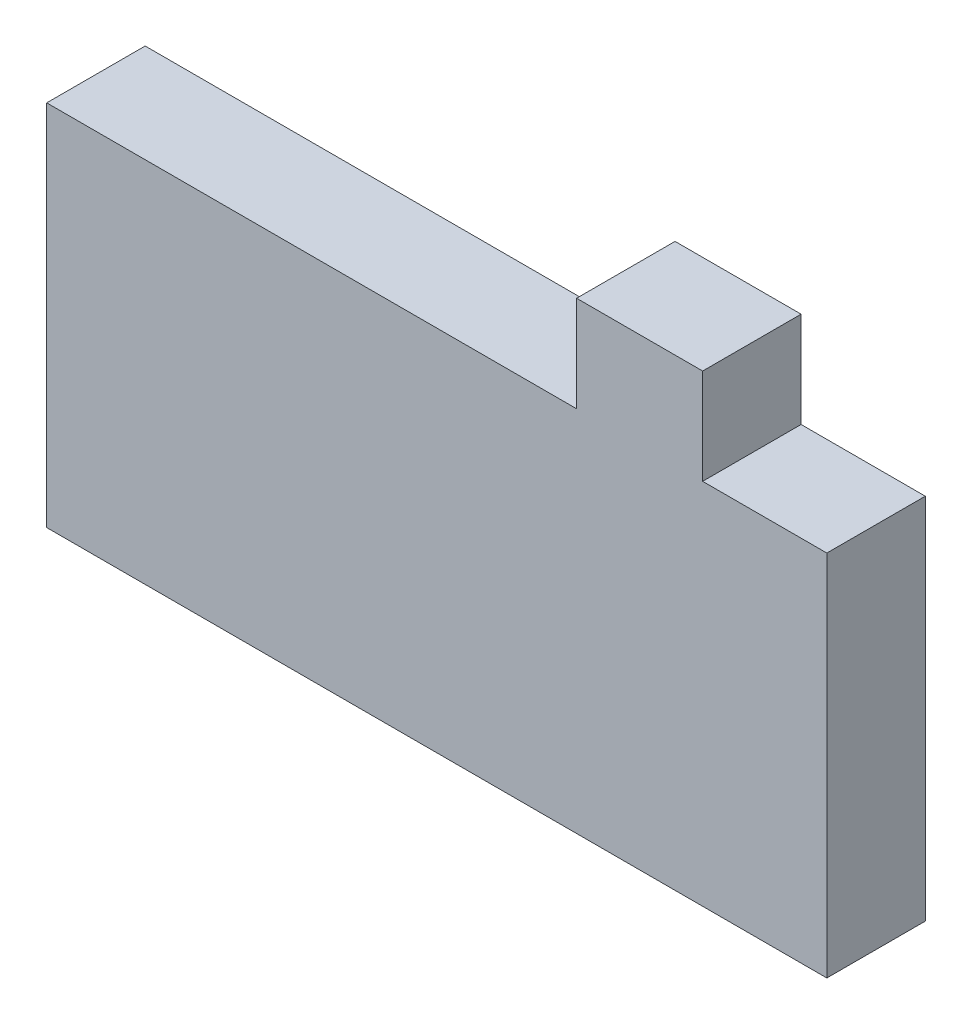
ISO-10303-21;
HEADER;
FILE_DESCRIPTION(('STEP AP214'),'2;1');
FILE_NAME('part.step','',(''),(''),'','','');
FILE_SCHEMA(('AUTOMOTIVE_DESIGN { 1 0 10303 214 1 1 1 1 }'));
ENDSEC;
DATA;
#1=APPLICATION_CONTEXT('core data for automotive mechanical design processes');
#2=APPLICATION_PROTOCOL_DEFINITION('international standard','automotive_design',2000,#1);
#3=PRODUCT_CONTEXT('',#1,'mechanical');
#4=PRODUCT('Part','Part','',(#3));
#5=PRODUCT_RELATED_PRODUCT_CATEGORY('part','',(#4));
#6=PRODUCT_DEFINITION_FORMATION('','',#4);
#7=PRODUCT_DEFINITION_CONTEXT('part definition',#1,'design');
#8=PRODUCT_DEFINITION('design','',#6,#7);
#9=PRODUCT_DEFINITION_SHAPE('','',#8);
#10=(LENGTH_UNIT() NAMED_UNIT(*) SI_UNIT(.MILLI.,.METRE.));
#11=(NAMED_UNIT(*) PLANE_ANGLE_UNIT() SI_UNIT($,.RADIAN.));
#12=(NAMED_UNIT(*) SI_UNIT($,.STERADIAN.) SOLID_ANGLE_UNIT());
#13=UNCERTAINTY_MEASURE_WITH_UNIT(LENGTH_MEASURE(1.E-05),#10,'distance_accuracy_value','');
#14=(GEOMETRIC_REPRESENTATION_CONTEXT(3) GLOBAL_UNCERTAINTY_ASSIGNED_CONTEXT((#13)) GLOBAL_UNIT_ASSIGNED_CONTEXT((#10,
#11,#12)) REPRESENTATION_CONTEXT('',''));
#15=CARTESIAN_POINT('',(0.,0.,0.));
#16=DIRECTION('',(0.,0.,1.));
#17=DIRECTION('',(1.,0.,0.));
#18=AXIS2_PLACEMENT_3D('',#15,#16,#17);
#19=CARTESIAN_POINT('',(-61.3363295036592,27.7399573483474,20.));
#20=DIRECTION('',(1.,0.,0.));
#21=DIRECTION('',(0.,0.,-1.));
#22=AXIS2_PLACEMENT_3D('',#19,#20,#21);
#23=PLANE('',#22);
#24=DIRECTION('',(0.,-1.,0.));
#25=VECTOR('',#24,1.);
#26=CARTESIAN_POINT('',(-61.3363295036592,27.7399573483474,0.));
#27=LINE('',#26,#25);
#28=CARTESIAN_POINT('',(-61.3363295036592,27.7399573483474,0.));
#29=VERTEX_POINT('',#28);
#30=CARTESIAN_POINT('',(-61.3363295036592,-46.9810183432283,0.));
#31=VERTEX_POINT('',#30);
#32=EDGE_CURVE('E145',#29,#31,#27,.T.);
#33=ORIENTED_EDGE('',*,*,#32,.T.);
#34=DIRECTION('',(0.,0.,-1.));
#35=VECTOR('',#34,1.);
#36=CARTESIAN_POINT('',(-61.3363295036592,-46.9810183432283,20.));
#37=LINE('',#36,#35);
#38=CARTESIAN_POINT('',(-61.3363295036592,-46.9810183432283,20.));
#39=VERTEX_POINT('',#38);
#40=EDGE_CURVE('E11',#39,#31,#37,.T.);
#41=ORIENTED_EDGE('',*,*,#40,.F.);
#42=DIRECTION('',(0.,-1.,0.));
#43=VECTOR('',#42,1.);
#44=CARTESIAN_POINT('',(-61.3363295036592,27.7399573483474,20.));
#45=LINE('',#44,#43);
#46=CARTESIAN_POINT('',(-61.3363295036592,27.7399573483474,20.));
#47=VERTEX_POINT('',#46);
#48=EDGE_CURVE('E161',#47,#39,#45,.T.);
#49=ORIENTED_EDGE('',*,*,#48,.F.);
#50=DIRECTION('',(0.,0.,-1.));
#51=VECTOR('',#50,1.);
#52=CARTESIAN_POINT('',(-61.3363295036592,27.7399573483474,20.));
#53=LINE('',#52,#51);
#54=EDGE_CURVE('E141',#47,#29,#53,.T.);
#55=ORIENTED_EDGE('',*,*,#54,.T.);
#56=EDGE_LOOP('',(#33,#41,#49,#55));
#57=FACE_BOUND('',#56,.T.);
#58=ADVANCED_FACE('F37',(#57),#23,.F.);
#59=CARTESIAN_POINT('',(-61.3363295036592,-46.9810183432283,20.));
#60=DIRECTION('',(0.,1.,0.));
#61=DIRECTION('',(0.,0.,1.));
#62=AXIS2_PLACEMENT_3D('',#59,#60,#61);
#63=PLANE('',#62);
#64=DIRECTION('',(1.,0.,0.));
#65=VECTOR('',#64,1.);
#66=CARTESIAN_POINT('',(-61.3363295036592,-46.9810183432283,0.));
#67=LINE('',#66,#65);
#68=CARTESIAN_POINT('',(97.1313910984997,-46.9810183432283,0.));
#69=VERTEX_POINT('',#68);
#70=EDGE_CURVE('E148',#31,#69,#67,.T.);
#71=ORIENTED_EDGE('',*,*,#70,.T.);
#72=DIRECTION('',(0.,0.,-1.));
#73=VECTOR('',#72,1.);
#74=CARTESIAN_POINT('',(97.1313910984997,-46.9810183432283,20.));
#75=LINE('',#74,#73);
#76=CARTESIAN_POINT('',(97.1313910984997,-46.9810183432283,20.));
#77=VERTEX_POINT('',#76);
#78=EDGE_CURVE('E44',#77,#69,#75,.T.);
#79=ORIENTED_EDGE('',*,*,#78,.F.);
#80=DIRECTION('',(1.,0.,0.));
#81=VECTOR('',#80,1.);
#82=CARTESIAN_POINT('',(-61.3363295036592,-46.9810183432283,20.));
#83=LINE('',#82,#81);
#84=EDGE_CURVE('E101',#39,#77,#83,.T.);
#85=ORIENTED_EDGE('',*,*,#84,.F.);
#86=ORIENTED_EDGE('',*,*,#40,.T.);
#87=EDGE_LOOP('',(#71,#79,#85,#86));
#88=FACE_BOUND('',#87,.T.);
#89=ADVANCED_FACE('F324',(#88),#63,.F.);
#90=CARTESIAN_POINT('',(97.1313910984997,-46.9810183432283,20.));
#91=DIRECTION('',(-1.,0.,0.));
#92=DIRECTION('',(0.,0.,1.));
#93=AXIS2_PLACEMENT_3D('',#90,#91,#92);
#94=PLANE('',#93);
#95=DIRECTION('',(0.,1.,0.));
#96=VECTOR('',#95,1.);
#97=CARTESIAN_POINT('',(97.1313910984997,-46.9810183432283,0.));
#98=LINE('',#97,#96);
#99=CARTESIAN_POINT('',(97.1313910984997,27.7784592584961,0.));
#100=VERTEX_POINT('',#99);
#101=EDGE_CURVE('E151',#69,#100,#98,.T.);
#102=ORIENTED_EDGE('',*,*,#101,.T.);
#103=DIRECTION('',(0.,0.,-1.));
#104=VECTOR('',#103,1.);
#105=CARTESIAN_POINT('',(97.1313910984997,27.7784592584961,20.));
#106=LINE('',#105,#104);
#107=CARTESIAN_POINT('',(97.1313910984997,27.7784592584961,20.));
#108=VERTEX_POINT('',#107);
#109=EDGE_CURVE('E168',#108,#100,#106,.T.);
#110=ORIENTED_EDGE('',*,*,#109,.F.);
#111=DIRECTION('',(0.,1.,0.));
#112=VECTOR('',#111,1.);
#113=CARTESIAN_POINT('',(97.1313910984997,-46.9810183432283,20.));
#114=LINE('',#113,#112);
#115=EDGE_CURVE('E176',#77,#108,#114,.T.);
#116=ORIENTED_EDGE('',*,*,#115,.F.);
#117=ORIENTED_EDGE('',*,*,#78,.T.);
#118=EDGE_LOOP('',(#102,#110,#116,#117));
#119=FACE_BOUND('',#118,.T.);
#120=ADVANCED_FACE('F174',(#119),#94,.F.);
#121=CARTESIAN_POINT('',(97.1313910984997,27.7784592584961,20.));
#122=DIRECTION('',(0.,-1.,0.));
#123=DIRECTION('',(0.,0.,-1.));
#124=AXIS2_PLACEMENT_3D('',#121,#122,#123);
#125=PLANE('',#124);
#126=DIRECTION('',(-1.,0.,0.));
#127=VECTOR('',#126,1.);
#128=CARTESIAN_POINT('',(97.1313910984997,27.7784592584961,0.));
#129=LINE('',#128,#127);
#130=CARTESIAN_POINT('',(71.9043169740652,27.7784592584961,0.));
#131=VERTEX_POINT('',#130);
#132=EDGE_CURVE('E153',#100,#131,#129,.T.);
#133=ORIENTED_EDGE('',*,*,#132,.T.);
#134=DIRECTION('',(0.,0.,-1.));
#135=VECTOR('',#134,1.);
#136=CARTESIAN_POINT('',(71.9043169740652,27.7784592584961,20.));
#137=LINE('',#136,#135);
#138=CARTESIAN_POINT('',(71.9043169740652,27.7784592584961,20.));
#139=VERTEX_POINT('',#138);
#140=EDGE_CURVE('E165',#139,#131,#137,.T.);
#141=ORIENTED_EDGE('',*,*,#140,.F.);
#142=DIRECTION('',(-1.,0.,0.));
#143=VECTOR('',#142,1.);
#144=CARTESIAN_POINT('',(97.1313910984997,27.7784592584961,20.));
#145=LINE('',#144,#143);
#146=EDGE_CURVE('E188',#108,#139,#145,.T.);
#147=ORIENTED_EDGE('',*,*,#146,.F.);
#148=ORIENTED_EDGE('',*,*,#109,.T.);
#149=EDGE_LOOP('',(#133,#141,#147,#148));
#150=FACE_BOUND('',#149,.T.);
#151=ADVANCED_FACE('F184',(#150),#125,.F.);
#152=CARTESIAN_POINT('',(71.9043169740652,27.7784592584961,20.));
#153=DIRECTION('',(-1.,0.,0.));
#154=DIRECTION('',(0.,0.,1.));
#155=AXIS2_PLACEMENT_3D('',#152,#153,#154);
#156=PLANE('',#155);
#157=DIRECTION('',(0.,1.,0.));
#158=VECTOR('',#157,1.);
#159=CARTESIAN_POINT('',(71.9043169740652,27.7784592584961,0.));
#160=LINE('',#159,#158);
#161=CARTESIAN_POINT('',(71.9043169740652,47.1850451248433,0.));
#162=VERTEX_POINT('',#161);
#163=EDGE_CURVE('E155',#131,#162,#160,.T.);
#164=ORIENTED_EDGE('',*,*,#163,.T.);
#165=DIRECTION('',(0.,0.,-1.));
#166=VECTOR('',#165,1.);
#167=CARTESIAN_POINT('',(71.9043169740652,47.1850451248433,20.));
#168=LINE('',#167,#166);
#169=CARTESIAN_POINT('',(71.9043169740652,47.1850451248433,20.));
#170=VERTEX_POINT('',#169);
#171=EDGE_CURVE('E136',#170,#162,#168,.T.);
#172=ORIENTED_EDGE('',*,*,#171,.F.);
#173=DIRECTION('',(0.,1.,0.));
#174=VECTOR('',#173,1.);
#175=CARTESIAN_POINT('',(71.9043169740652,27.7784592584961,20.));
#176=LINE('',#175,#174);
#177=EDGE_CURVE('E124',#139,#170,#176,.T.);
#178=ORIENTED_EDGE('',*,*,#177,.F.);
#179=ORIENTED_EDGE('',*,*,#140,.T.);
#180=EDGE_LOOP('',(#164,#172,#178,#179));
#181=FACE_BOUND('',#180,.T.);
#182=ADVANCED_FACE('F187',(#181),#156,.F.);
#183=CARTESIAN_POINT('',(71.9043169740652,47.1850451248433,20.));
#184=DIRECTION('',(0.,-1.,0.));
#185=DIRECTION('',(0.,0.,-1.));
#186=AXIS2_PLACEMENT_3D('',#183,#184,#185);
#187=PLANE('',#186);
#188=DIRECTION('',(-1.,0.,0.));
#189=VECTOR('',#188,1.);
#190=CARTESIAN_POINT('',(71.9043169740652,47.1850451248433,0.));
#191=LINE('',#190,#189);
#192=CARTESIAN_POINT('',(46.2999112180197,47.1850451248433,0.));
#193=VERTEX_POINT('',#192);
#194=EDGE_CURVE('E133',#162,#193,#191,.T.);
#195=ORIENTED_EDGE('',*,*,#194,.T.);
#196=DIRECTION('',(0.,0.,-1.));
#197=VECTOR('',#196,1.);
#198=CARTESIAN_POINT('',(46.2999112180197,47.1850451248433,20.));
#199=LINE('',#198,#197);
#200=CARTESIAN_POINT('',(46.2999112180197,47.1850451248433,20.));
#201=VERTEX_POINT('',#200);
#202=EDGE_CURVE('E130',#201,#193,#199,.T.);
#203=ORIENTED_EDGE('',*,*,#202,.F.);
#204=DIRECTION('',(-1.,0.,0.));
#205=VECTOR('',#204,1.);
#206=CARTESIAN_POINT('',(71.9043169740652,47.1850451248433,20.));
#207=LINE('',#206,#205);
#208=EDGE_CURVE('E117',#170,#201,#207,.T.);
#209=ORIENTED_EDGE('',*,*,#208,.F.);
#210=ORIENTED_EDGE('',*,*,#171,.T.);
#211=EDGE_LOOP('',(#195,#203,#209,#210));
#212=FACE_BOUND('',#211,.T.);
#213=ADVANCED_FACE('F131',(#212),#187,.F.);
#214=CARTESIAN_POINT('',(46.2999112180197,47.1850451248433,20.));
#215=DIRECTION('',(1.,0.,0.));
#216=DIRECTION('',(0.,0.,-1.));
#217=AXIS2_PLACEMENT_3D('',#214,#215,#216);
#218=PLANE('',#217);
#219=DIRECTION('',(0.,-1.,0.));
#220=VECTOR('',#219,1.);
#221=CARTESIAN_POINT('',(46.2999112180197,47.1850451248433,0.));
#222=LINE('',#221,#220);
#223=CARTESIAN_POINT('',(46.2999112180197,27.7399573483474,0.));
#224=VERTEX_POINT('',#223);
#225=EDGE_CURVE('E158',#193,#224,#222,.T.);
#226=ORIENTED_EDGE('',*,*,#225,.T.);
#227=DIRECTION('',(0.,0.,-1.));
#228=VECTOR('',#227,1.);
#229=CARTESIAN_POINT('',(46.2999112180197,27.7399573483474,20.));
#230=LINE('',#229,#228);
#231=CARTESIAN_POINT('',(46.2999112180197,27.7399573483474,20.));
#232=VERTEX_POINT('',#231);
#233=EDGE_CURVE('E137',#232,#224,#230,.T.);
#234=ORIENTED_EDGE('',*,*,#233,.F.);
#235=DIRECTION('',(0.,-1.,0.));
#236=VECTOR('',#235,1.);
#237=CARTESIAN_POINT('',(46.2999112180197,47.1850451248433,20.));
#238=LINE('',#237,#236);
#239=EDGE_CURVE('E121',#201,#232,#238,.T.);
#240=ORIENTED_EDGE('',*,*,#239,.F.);
#241=ORIENTED_EDGE('',*,*,#202,.T.);
#242=EDGE_LOOP('',(#226,#234,#240,#241));
#243=FACE_BOUND('',#242,.T.);
#244=ADVANCED_FACE('F139',(#243),#218,.F.);
#245=CARTESIAN_POINT('',(46.2999112180197,27.7399573483474,20.));
#246=DIRECTION('',(0.,-1.,0.));
#247=DIRECTION('',(1.,0.,0.));
#248=AXIS2_PLACEMENT_3D('',#245,#246,#247);
#249=PLANE('',#248);
#250=DIRECTION('',(-1.,0.,0.));
#251=VECTOR('',#250,1.);
#252=CARTESIAN_POINT('',(46.2999112180197,27.7399573483474,0.));
#253=LINE('',#252,#251);
#254=EDGE_CURVE('E93',#224,#29,#253,.T.);
#255=ORIENTED_EDGE('',*,*,#254,.T.);
#256=ORIENTED_EDGE('',*,*,#54,.F.);
#257=DIRECTION('',(-1.,0.,0.));
#258=VECTOR('',#257,1.);
#259=CARTESIAN_POINT('',(46.2999112180197,27.7399573483474,20.));
#260=LINE('',#259,#258);
#261=EDGE_CURVE('E60',#232,#47,#260,.T.);
#262=ORIENTED_EDGE('',*,*,#261,.F.);
#263=ORIENTED_EDGE('',*,*,#233,.T.);
#264=EDGE_LOOP('',(#255,#256,#262,#263));
#265=FACE_BOUND('',#264,.T.);
#266=ADVANCED_FACE('F331',(#265),#249,.F.);
#267=CARTESIAN_POINT('',(0.,0.,20.));
#268=DIRECTION('',(0.,0.,1.));
#269=DIRECTION('',(1.,0.,0.));
#270=AXIS2_PLACEMENT_3D('',#267,#268,#269);
#271=PLANE('',#270);
#272=ORIENTED_EDGE('',*,*,#48,.T.);
#273=ORIENTED_EDGE('',*,*,#84,.T.);
#274=ORIENTED_EDGE('',*,*,#115,.T.);
#275=ORIENTED_EDGE('',*,*,#146,.T.);
#276=ORIENTED_EDGE('',*,*,#177,.T.);
#277=ORIENTED_EDGE('',*,*,#208,.T.);
#278=ORIENTED_EDGE('',*,*,#239,.T.);
#279=ORIENTED_EDGE('',*,*,#261,.T.);
#280=EDGE_LOOP('',(#272,#273,#274,#275,#276,#277,#278,#279));
#281=FACE_BOUND('',#280,.T.);
#282=ADVANCED_FACE('F119',(#281),#271,.T.);
#283=CARTESIAN_POINT('',(0.,0.,0.));
#284=DIRECTION('',(0.,0.,1.));
#285=DIRECTION('',(1.,0.,0.));
#286=AXIS2_PLACEMENT_3D('',#283,#284,#285);
#287=PLANE('',#286);
#288=DIRECTION('',(-1.,0.,0.));
#289=VECTOR('',#288,1.);
#290=CARTESIAN_POINT('',(46.2999112180197,22.7399573483474,0.));
#291=LINE('',#290,#289);
#292=CARTESIAN_POINT('',(51.2999112180197,22.7399573483474,0.));
#293=VERTEX_POINT('',#292);
#294=CARTESIAN_POINT('',(-56.3363295036592,22.7399573483474,0.));
#295=VERTEX_POINT('',#294);
#296=EDGE_CURVE('E211',#293,#295,#291,.T.);
#297=ORIENTED_EDGE('',*,*,#296,.T.);
#298=DIRECTION('',(0.,-1.,0.));
#299=VECTOR('',#298,1.);
#300=CARTESIAN_POINT('',(-56.3363295036592,27.7399573483474,0.));
#301=LINE('',#300,#299);
#302=CARTESIAN_POINT('',(-56.3363295036592,-41.9810183432283,0.));
#303=VERTEX_POINT('',#302);
#304=EDGE_CURVE('E197',#295,#303,#301,.T.);
#305=ORIENTED_EDGE('',*,*,#304,.T.);
#306=DIRECTION('',(1.,0.,0.));
#307=VECTOR('',#306,1.);
#308=CARTESIAN_POINT('',(-61.3363295036592,-41.9810183432283,0.));
#309=LINE('',#308,#307);
#310=CARTESIAN_POINT('',(92.1313910984997,-41.9810183432283,0.));
#311=VERTEX_POINT('',#310);
#312=EDGE_CURVE('E194',#303,#311,#309,.T.);
#313=ORIENTED_EDGE('',*,*,#312,.T.);
#314=DIRECTION('',(0.,1.,0.));
#315=VECTOR('',#314,1.);
#316=CARTESIAN_POINT('',(92.1313910984997,-46.9810183432283,0.));
#317=LINE('',#316,#315);
#318=CARTESIAN_POINT('',(92.1313910984997,22.7784592584961,0.));
#319=VERTEX_POINT('',#318);
#320=EDGE_CURVE('E51',#311,#319,#317,.T.);
#321=ORIENTED_EDGE('',*,*,#320,.T.);
#322=DIRECTION('',(-1.,0.,0.));
#323=VECTOR('',#322,1.);
#324=CARTESIAN_POINT('',(97.1313910984997,22.7784592584961,0.));
#325=LINE('',#324,#323);
#326=CARTESIAN_POINT('',(66.9043169740652,22.7784592584961,0.));
#327=VERTEX_POINT('',#326);
#328=EDGE_CURVE('E199',#319,#327,#325,.T.);
#329=ORIENTED_EDGE('',*,*,#328,.T.);
#330=DIRECTION('',(0.,1.,0.));
#331=VECTOR('',#330,1.);
#332=CARTESIAN_POINT('',(66.9043169740652,27.7784592584961,0.));
#333=LINE('',#332,#331);
#334=CARTESIAN_POINT('',(66.9043169740652,42.1850451248433,0.));
#335=VERTEX_POINT('',#334);
#336=EDGE_CURVE('E202',#327,#335,#333,.T.);
#337=ORIENTED_EDGE('',*,*,#336,.T.);
#338=DIRECTION('',(-1.,0.,0.));
#339=VECTOR('',#338,1.);
#340=CARTESIAN_POINT('',(71.9043169740652,42.1850451248433,0.));
#341=LINE('',#340,#339);
#342=CARTESIAN_POINT('',(51.2999112180197,42.1850451248433,0.));
#343=VERTEX_POINT('',#342);
#344=EDGE_CURVE('E205',#335,#343,#341,.T.);
#345=ORIENTED_EDGE('',*,*,#344,.T.);
#346=DIRECTION('',(0.,-1.,0.));
#347=VECTOR('',#346,1.);
#348=CARTESIAN_POINT('',(51.2999112180197,47.1850451248433,0.));
#349=LINE('',#348,#347);
#350=EDGE_CURVE('E208',#343,#293,#349,.T.);
#351=ORIENTED_EDGE('',*,*,#350,.T.);
#352=EDGE_LOOP('',(#297,#305,#313,#321,#329,#337,#345,#351));
#353=FACE_BOUND('',#352,.T.);
#354=ORIENTED_EDGE('',*,*,#32,.F.);
#355=ORIENTED_EDGE('',*,*,#254,.F.);
#356=ORIENTED_EDGE('',*,*,#225,.F.);
#357=ORIENTED_EDGE('',*,*,#194,.F.);
#358=ORIENTED_EDGE('',*,*,#163,.F.);
#359=ORIENTED_EDGE('',*,*,#132,.F.);
#360=ORIENTED_EDGE('',*,*,#101,.F.);
#361=ORIENTED_EDGE('',*,*,#70,.F.);
#362=EDGE_LOOP('',(#354,#355,#356,#357,#358,#359,#360,#361));
#363=FACE_BOUND('',#362,.T.);
#364=ADVANCED_FACE('F180',(#353,#363),#287,.F.);
#365=CARTESIAN_POINT('',(-56.3363295036592,27.7399573483474,20.));
#366=DIRECTION('',(1.,0.,0.));
#367=DIRECTION('',(0.,0.,-1.));
#368=AXIS2_PLACEMENT_3D('',#365,#366,#367);
#369=PLANE('',#368);
#370=ORIENTED_EDGE('',*,*,#304,.F.);
#371=DIRECTION('',(0.,0.,-1.));
#372=VECTOR('',#371,1.);
#373=CARTESIAN_POINT('',(-56.3363295036592,22.7399573483474,20.));
#374=LINE('',#373,#372);
#375=CARTESIAN_POINT('',(-56.3363295036592,22.7399573483474,15.));
#376=VERTEX_POINT('',#375);
#377=EDGE_CURVE('E220',#376,#295,#374,.T.);
#378=ORIENTED_EDGE('',*,*,#377,.F.);
#379=DIRECTION('',(0.,-1.,0.));
#380=VECTOR('',#379,1.);
#381=CARTESIAN_POINT('',(-56.3363295036592,27.7399573483474,15.));
#382=LINE('',#381,#380);
#383=CARTESIAN_POINT('',(-56.3363295036592,-41.9810183432283,15.));
#384=VERTEX_POINT('',#383);
#385=EDGE_CURVE('E214',#376,#384,#382,.T.);
#386=ORIENTED_EDGE('',*,*,#385,.T.);
#387=DIRECTION('',(0.,0.,-1.));
#388=VECTOR('',#387,1.);
#389=CARTESIAN_POINT('',(-56.3363295036592,-41.9810183432283,20.));
#390=LINE('',#389,#388);
#391=EDGE_CURVE('E149',#384,#303,#390,.T.);
#392=ORIENTED_EDGE('',*,*,#391,.T.);
#393=EDGE_LOOP('',(#370,#378,#386,#392));
#394=FACE_BOUND('',#393,.T.);
#395=ADVANCED_FACE('F263',(#394),#369,.T.);
#396=CARTESIAN_POINT('',(-61.3363295036592,-41.9810183432283,20.));
#397=DIRECTION('',(0.,1.,0.));
#398=DIRECTION('',(0.,0.,1.));
#399=AXIS2_PLACEMENT_3D('',#396,#397,#398);
#400=PLANE('',#399);
#401=ORIENTED_EDGE('',*,*,#312,.F.);
#402=ORIENTED_EDGE('',*,*,#391,.F.);
#403=DIRECTION('',(1.,0.,0.));
#404=VECTOR('',#403,1.);
#405=CARTESIAN_POINT('',(-61.3363295036592,-41.9810183432283,15.));
#406=LINE('',#405,#404);
#407=CARTESIAN_POINT('',(92.1313910984997,-41.9810183432283,15.));
#408=VERTEX_POINT('',#407);
#409=EDGE_CURVE('E249',#384,#408,#406,.T.);
#410=ORIENTED_EDGE('',*,*,#409,.T.);
#411=DIRECTION('',(0.,0.,-1.));
#412=VECTOR('',#411,1.);
#413=CARTESIAN_POINT('',(92.1313910984997,-41.9810183432283,20.));
#414=LINE('',#413,#412);
#415=EDGE_CURVE('E251',#408,#311,#414,.T.);
#416=ORIENTED_EDGE('',*,*,#415,.T.);
#417=EDGE_LOOP('',(#401,#402,#410,#416));
#418=FACE_BOUND('',#417,.T.);
#419=ADVANCED_FACE('F399',(#418),#400,.T.);
#420=CARTESIAN_POINT('',(92.1313910984997,-46.9810183432283,20.));
#421=DIRECTION('',(-1.,0.,0.));
#422=DIRECTION('',(0.,0.,1.));
#423=AXIS2_PLACEMENT_3D('',#420,#421,#422);
#424=PLANE('',#423);
#425=ORIENTED_EDGE('',*,*,#320,.F.);
#426=ORIENTED_EDGE('',*,*,#415,.F.);
#427=DIRECTION('',(0.,1.,0.));
#428=VECTOR('',#427,1.);
#429=CARTESIAN_POINT('',(92.1313910984997,-46.9810183432283,15.));
#430=LINE('',#429,#428);
#431=CARTESIAN_POINT('',(92.1313910984997,22.7784592584961,15.));
#432=VERTEX_POINT('',#431);
#433=EDGE_CURVE('E243',#408,#432,#430,.T.);
#434=ORIENTED_EDGE('',*,*,#433,.T.);
#435=DIRECTION('',(0.,0.,-1.));
#436=VECTOR('',#435,1.);
#437=CARTESIAN_POINT('',(92.1313910984997,22.7784592584961,20.));
#438=LINE('',#437,#436);
#439=EDGE_CURVE('E246',#432,#319,#438,.T.);
#440=ORIENTED_EDGE('',*,*,#439,.T.);
#441=EDGE_LOOP('',(#425,#426,#434,#440));
#442=FACE_BOUND('',#441,.T.);
#443=ADVANCED_FACE('F292',(#442),#424,.T.);
#444=CARTESIAN_POINT('',(97.1313910984997,22.7784592584961,20.));
#445=DIRECTION('',(0.,-1.,0.));
#446=DIRECTION('',(0.,0.,-1.));
#447=AXIS2_PLACEMENT_3D('',#444,#445,#446);
#448=PLANE('',#447);
#449=ORIENTED_EDGE('',*,*,#328,.F.);
#450=ORIENTED_EDGE('',*,*,#439,.F.);
#451=DIRECTION('',(-1.,0.,0.));
#452=VECTOR('',#451,1.);
#453=CARTESIAN_POINT('',(97.1313910984997,22.7784592584961,15.));
#454=LINE('',#453,#452);
#455=CARTESIAN_POINT('',(66.9043169740652,22.7784592584961,15.));
#456=VERTEX_POINT('',#455);
#457=EDGE_CURVE('E237',#432,#456,#454,.T.);
#458=ORIENTED_EDGE('',*,*,#457,.T.);
#459=DIRECTION('',(0.,0.,-1.));
#460=VECTOR('',#459,1.);
#461=CARTESIAN_POINT('',(66.9043169740652,22.7784592584961,20.));
#462=LINE('',#461,#460);
#463=EDGE_CURVE('E240',#456,#327,#462,.T.);
#464=ORIENTED_EDGE('',*,*,#463,.T.);
#465=EDGE_LOOP('',(#449,#450,#458,#464));
#466=FACE_BOUND('',#465,.T.);
#467=ADVANCED_FACE('F297',(#466),#448,.T.);
#468=CARTESIAN_POINT('',(66.9043169740652,27.7784592584961,20.));
#469=DIRECTION('',(-1.,0.,0.));
#470=DIRECTION('',(0.,0.,1.));
#471=AXIS2_PLACEMENT_3D('',#468,#469,#470);
#472=PLANE('',#471);
#473=ORIENTED_EDGE('',*,*,#336,.F.);
#474=ORIENTED_EDGE('',*,*,#463,.F.);
#475=DIRECTION('',(0.,1.,0.));
#476=VECTOR('',#475,1.);
#477=CARTESIAN_POINT('',(66.9043169740652,27.7784592584961,15.));
#478=LINE('',#477,#476);
#479=CARTESIAN_POINT('',(66.9043169740652,42.1850451248433,15.));
#480=VERTEX_POINT('',#479);
#481=EDGE_CURVE('E231',#456,#480,#478,.T.);
#482=ORIENTED_EDGE('',*,*,#481,.T.);
#483=DIRECTION('',(0.,0.,-1.));
#484=VECTOR('',#483,1.);
#485=CARTESIAN_POINT('',(66.9043169740652,42.1850451248433,20.));
#486=LINE('',#485,#484);
#487=EDGE_CURVE('E234',#480,#335,#486,.T.);
#488=ORIENTED_EDGE('',*,*,#487,.T.);
#489=EDGE_LOOP('',(#473,#474,#482,#488));
#490=FACE_BOUND('',#489,.T.);
#491=ADVANCED_FACE('F302',(#490),#472,.T.);
#492=CARTESIAN_POINT('',(71.9043169740652,42.1850451248433,20.));
#493=DIRECTION('',(0.,-1.,0.));
#494=DIRECTION('',(0.,0.,-1.));
#495=AXIS2_PLACEMENT_3D('',#492,#493,#494);
#496=PLANE('',#495);
#497=ORIENTED_EDGE('',*,*,#344,.F.);
#498=ORIENTED_EDGE('',*,*,#487,.F.);
#499=DIRECTION('',(-1.,0.,0.));
#500=VECTOR('',#499,1.);
#501=CARTESIAN_POINT('',(71.9043169740652,42.1850451248433,15.));
#502=LINE('',#501,#500);
#503=CARTESIAN_POINT('',(51.2999112180197,42.1850451248433,15.));
#504=VERTEX_POINT('',#503);
#505=EDGE_CURVE('E224',#480,#504,#502,.T.);
#506=ORIENTED_EDGE('',*,*,#505,.T.);
#507=DIRECTION('',(0.,0.,-1.));
#508=VECTOR('',#507,1.);
#509=CARTESIAN_POINT('',(51.2999112180197,42.1850451248433,20.));
#510=LINE('',#509,#508);
#511=EDGE_CURVE('E228',#504,#343,#510,.T.);
#512=ORIENTED_EDGE('',*,*,#511,.T.);
#513=EDGE_LOOP('',(#497,#498,#506,#512));
#514=FACE_BOUND('',#513,.T.);
#515=ADVANCED_FACE('F309',(#514),#496,.T.);
#516=CARTESIAN_POINT('',(51.2999112180197,47.1850451248433,20.));
#517=DIRECTION('',(1.,0.,0.));
#518=DIRECTION('',(0.,0.,-1.));
#519=AXIS2_PLACEMENT_3D('',#516,#517,#518);
#520=PLANE('',#519);
#521=ORIENTED_EDGE('',*,*,#350,.F.);
#522=ORIENTED_EDGE('',*,*,#511,.F.);
#523=DIRECTION('',(0.,-1.,0.));
#524=VECTOR('',#523,1.);
#525=CARTESIAN_POINT('',(51.2999112180197,47.1850451248433,15.));
#526=LINE('',#525,#524);
#527=CARTESIAN_POINT('',(51.2999112180197,22.7399573483474,15.));
#528=VERTEX_POINT('',#527);
#529=EDGE_CURVE('E221',#504,#528,#526,.T.);
#530=ORIENTED_EDGE('',*,*,#529,.T.);
#531=DIRECTION('',(0.,0.,-1.));
#532=VECTOR('',#531,1.);
#533=CARTESIAN_POINT('',(51.2999112180197,22.7399573483474,20.));
#534=LINE('',#533,#532);
#535=EDGE_CURVE('E225',#528,#293,#534,.T.);
#536=ORIENTED_EDGE('',*,*,#535,.T.);
#537=EDGE_LOOP('',(#521,#522,#530,#536));
#538=FACE_BOUND('',#537,.T.);
#539=ADVANCED_FACE('F313',(#538),#520,.T.);
#540=CARTESIAN_POINT('',(46.2999112180197,22.7399573483474,20.));
#541=DIRECTION('',(0.,-1.,0.));
#542=DIRECTION('',(1.,0.,0.));
#543=AXIS2_PLACEMENT_3D('',#540,#541,#542);
#544=PLANE('',#543);
#545=ORIENTED_EDGE('',*,*,#296,.F.);
#546=ORIENTED_EDGE('',*,*,#535,.F.);
#547=DIRECTION('',(-1.,0.,0.));
#548=VECTOR('',#547,1.);
#549=CARTESIAN_POINT('',(46.2999112180197,22.7399573483474,15.));
#550=LINE('',#549,#548);
#551=EDGE_CURVE('E217',#528,#376,#550,.T.);
#552=ORIENTED_EDGE('',*,*,#551,.T.);
#553=ORIENTED_EDGE('',*,*,#377,.T.);
#554=EDGE_LOOP('',(#545,#546,#552,#553));
#555=FACE_BOUND('',#554,.T.);
#556=ADVANCED_FACE('F278',(#555),#544,.T.);
#557=CARTESIAN_POINT('',(0.,0.,15.));
#558=DIRECTION('',(0.,0.,1.));
#559=DIRECTION('',(1.,0.,0.));
#560=AXIS2_PLACEMENT_3D('',#557,#558,#559);
#561=PLANE('',#560);
#562=ORIENTED_EDGE('',*,*,#385,.F.);
#563=ORIENTED_EDGE('',*,*,#551,.F.);
#564=ORIENTED_EDGE('',*,*,#529,.F.);
#565=ORIENTED_EDGE('',*,*,#505,.F.);
#566=ORIENTED_EDGE('',*,*,#481,.F.);
#567=ORIENTED_EDGE('',*,*,#457,.F.);
#568=ORIENTED_EDGE('',*,*,#433,.F.);
#569=ORIENTED_EDGE('',*,*,#409,.F.);
#570=EDGE_LOOP('',(#562,#563,#564,#565,#566,#567,#568,#569));
#571=FACE_BOUND('',#570,.T.);
#572=ADVANCED_FACE('F320',(#571),#561,.F.);
#573=CLOSED_SHELL('',(#58,#89,#120,#151,#182,#213,#244,#266,#282,#364,#395,#419,#443,#467,#491,
#515,#539,#556,#572));
#574=MANIFOLD_SOLID_BREP('B2',#573);
#575=ADVANCED_BREP_SHAPE_REPRESENTATION('',(#18,#574),#14);
#576=SHAPE_DEFINITION_REPRESENTATION(#9,#575);
ENDSEC;
END-ISO-10303-21;
